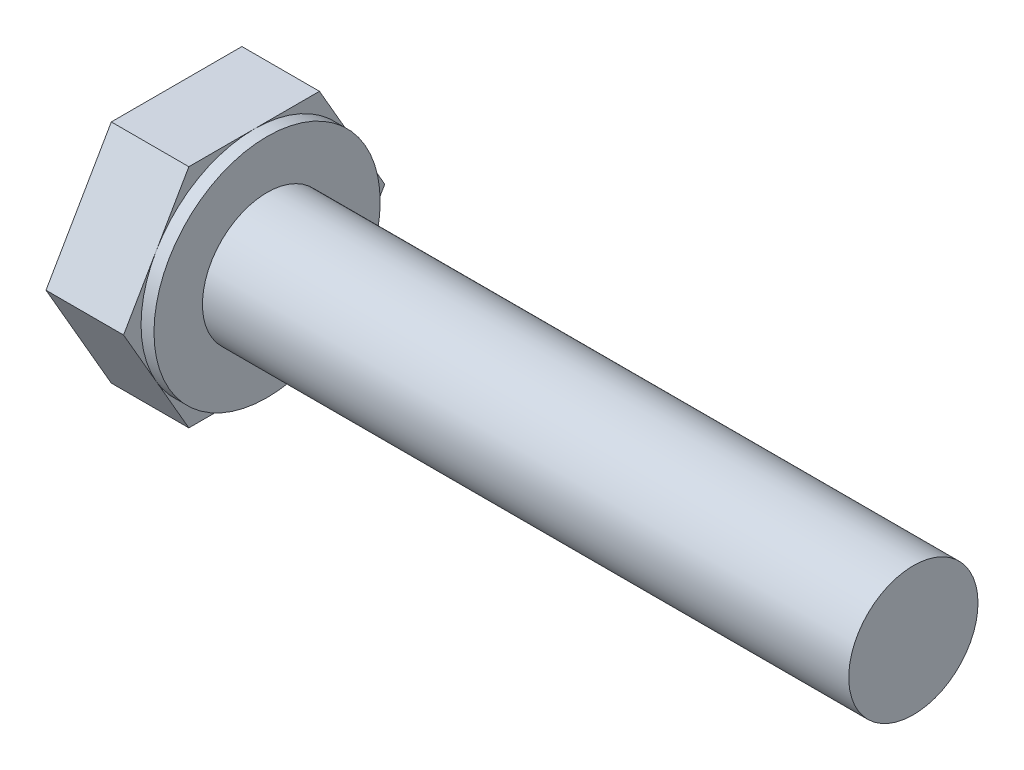
ISO-10303-21;
HEADER;
FILE_DESCRIPTION(('STEP AP214'),'2;1');
FILE_NAME('part.step','',(''),(''),'','','');
FILE_SCHEMA(('AUTOMOTIVE_DESIGN { 1 0 10303 214 1 1 1 1 }'));
ENDSEC;
DATA;
#1=APPLICATION_CONTEXT('core data for automotive mechanical design processes');
#2=APPLICATION_PROTOCOL_DEFINITION('international standard','automotive_design',2000,#1);
#3=PRODUCT_CONTEXT('',#1,'mechanical');
#4=PRODUCT('Part','Part','',(#3));
#5=PRODUCT_RELATED_PRODUCT_CATEGORY('part','',(#4));
#6=PRODUCT_DEFINITION_FORMATION('','',#4);
#7=PRODUCT_DEFINITION_CONTEXT('part definition',#1,'design');
#8=PRODUCT_DEFINITION('design','',#6,#7);
#9=PRODUCT_DEFINITION_SHAPE('','',#8);
#10=(LENGTH_UNIT() NAMED_UNIT(*) SI_UNIT(.MILLI.,.METRE.));
#11=(NAMED_UNIT(*) PLANE_ANGLE_UNIT() SI_UNIT($,.RADIAN.));
#12=(NAMED_UNIT(*) SI_UNIT($,.STERADIAN.) SOLID_ANGLE_UNIT());
#13=UNCERTAINTY_MEASURE_WITH_UNIT(LENGTH_MEASURE(1.E-05),#10,'distance_accuracy_value','');
#14=(GEOMETRIC_REPRESENTATION_CONTEXT(3) GLOBAL_UNCERTAINTY_ASSIGNED_CONTEXT((#13)) GLOBAL_UNIT_ASSIGNED_CONTEXT((#10,
#11,#12)) REPRESENTATION_CONTEXT('',''));
#15=CARTESIAN_POINT('',(0.,0.,0.));
#16=DIRECTION('',(0.,0.,1.));
#17=DIRECTION('',(1.,0.,0.));
#18=AXIS2_PLACEMENT_3D('',#15,#16,#17);
#19=CARTESIAN_POINT('',(0.4,0.,0.));
#20=DIRECTION('',(1.,0.,0.));
#21=DIRECTION('',(0.,0.,-1.));
#22=AXIS2_PLACEMENT_3D('',#19,#20,#21);
#23=PLANE('',#22);
#24=CARTESIAN_POINT('',(0.4,0.,0.));
#25=DIRECTION('',(1.,0.,0.));
#26=DIRECTION('',(0.,0.,-1.));
#27=AXIS2_PLACEMENT_3D('',#24,#25,#26);
#28=CIRCLE('',#27,3.5);
#29=CARTESIAN_POINT('',(0.4,0.,-3.5));
#30=VERTEX_POINT('',#29);
#31=EDGE_CURVE('E126',#30,#30,#28,.T.);
#32=ORIENTED_EDGE('',*,*,#31,.T.);
#33=EDGE_LOOP('',(#32));
#34=FACE_BOUND('',#33,.T.);
#35=CARTESIAN_POINT('',(0.4,0.,0.));
#36=DIRECTION('',(1.,0.,0.));
#37=DIRECTION('',(0.,0.,-1.));
#38=AXIS2_PLACEMENT_3D('',#35,#36,#37);
#39=CIRCLE('',#38,2.);
#40=CARTESIAN_POINT('',(0.4,0.,-2.));
#41=VERTEX_POINT('',#40);
#42=EDGE_CURVE('E349',#41,#41,#39,.T.);
#43=ORIENTED_EDGE('',*,*,#42,.F.);
#44=EDGE_LOOP('',(#43));
#45=FACE_BOUND('',#44,.T.);
#46=ADVANCED_FACE('F33',(#34,#45),#23,.T.);
#47=CARTESIAN_POINT('',(0.,0.,0.));
#48=DIRECTION('',(1.,0.,0.));
#49=DIRECTION('',(0.,0.,-1.));
#50=AXIS2_PLACEMENT_3D('',#47,#48,#49);
#51=PLANE('',#50);
#52=CARTESIAN_POINT('',(0.,0.,0.));
#53=DIRECTION('',(1.,0.,0.));
#54=DIRECTION('',(0.,0.,-1.));
#55=AXIS2_PLACEMENT_3D('',#52,#53,#54);
#56=CIRCLE('',#55,3.5);
#57=CARTESIAN_POINT('',(0.,1.75,-3.03108891324554));
#58=VERTEX_POINT('',#57);
#59=CARTESIAN_POINT('',(0.,3.5,0.));
#60=VERTEX_POINT('',#59);
#61=EDGE_CURVE('E44',#58,#60,#56,.T.);
#62=ORIENTED_EDGE('',*,*,#61,.F.);
#63=DIRECTION('',(0.,0.866025403784439,0.5));
#64=VECTOR('',#63,1.);
#65=CARTESIAN_POINT('',(0.,0.,-4.04145188432738));
#66=LINE('',#65,#64);
#67=CARTESIAN_POINT('',(0.,3.5,-2.02072594216369));
#68=VERTEX_POINT('',#67);
#69=EDGE_CURVE('E111',#58,#68,#66,.T.);
#70=ORIENTED_EDGE('',*,*,#69,.T.);
#71=DIRECTION('',(0.,0.,1.));
#72=VECTOR('',#71,1.);
#73=CARTESIAN_POINT('',(0.,3.5,-2.02072594216369));
#74=LINE('',#73,#72);
#75=EDGE_CURVE('E124',#68,#60,#74,.T.);
#76=ORIENTED_EDGE('',*,*,#75,.T.);
#77=EDGE_LOOP('',(#62,#70,#76));
#78=FACE_BOUND('',#77,.T.);
#79=ADVANCED_FACE('F123',(#78),#51,.T.);
#80=CARTESIAN_POINT('',(0.,1.75,3.03108891324554));
#81=VERTEX_POINT('',#80);
#82=EDGE_CURVE('E11',#60,#81,#56,.T.);
#83=ORIENTED_EDGE('',*,*,#82,.F.);
#84=CARTESIAN_POINT('',(0.,3.5,2.02072594216369));
#85=VERTEX_POINT('',#84);
#86=EDGE_CURVE('E110',#60,#85,#74,.T.);
#87=ORIENTED_EDGE('',*,*,#86,.T.);
#88=DIRECTION('',(0.,-0.866025403784439,0.5));
#89=VECTOR('',#88,1.);
#90=CARTESIAN_POINT('',(0.,3.5,2.02072594216369));
#91=LINE('',#90,#89);
#92=EDGE_CURVE('E156',#85,#81,#91,.T.);
#93=ORIENTED_EDGE('',*,*,#92,.T.);
#94=EDGE_LOOP('',(#83,#87,#93));
#95=FACE_BOUND('',#94,.T.);
#96=ADVANCED_FACE('F209',(#95),#51,.T.);
#97=CARTESIAN_POINT('',(0.,-1.75,3.03108891324554));
#98=VERTEX_POINT('',#97);
#99=EDGE_CURVE('E42',#81,#98,#56,.T.);
#100=ORIENTED_EDGE('',*,*,#99,.F.);
#101=CARTESIAN_POINT('',(0.,0.,4.04145188432738));
#102=VERTEX_POINT('',#101);
#103=EDGE_CURVE('E159',#81,#102,#91,.T.);
#104=ORIENTED_EDGE('',*,*,#103,.T.);
#105=DIRECTION('',(0.,-0.866025403784439,-0.5));
#106=VECTOR('',#105,1.);
#107=CARTESIAN_POINT('',(0.,0.,4.04145188432738));
#108=LINE('',#107,#106);
#109=EDGE_CURVE('E160',#102,#98,#108,.T.);
#110=ORIENTED_EDGE('',*,*,#109,.T.);
#111=EDGE_LOOP('',(#100,#104,#110));
#112=FACE_BOUND('',#111,.T.);
#113=ADVANCED_FACE('F190',(#112),#51,.T.);
#114=CARTESIAN_POINT('',(0.,-3.5,0.));
#115=VERTEX_POINT('',#114);
#116=EDGE_CURVE('E133',#98,#115,#56,.T.);
#117=ORIENTED_EDGE('',*,*,#116,.F.);
#118=CARTESIAN_POINT('',(0.,-3.5,2.02072594216369));
#119=VERTEX_POINT('',#118);
#120=EDGE_CURVE('E158',#98,#119,#108,.T.);
#121=ORIENTED_EDGE('',*,*,#120,.T.);
#122=DIRECTION('',(0.,0.,-1.));
#123=VECTOR('',#122,1.);
#124=CARTESIAN_POINT('',(0.,-3.5,2.02072594216369));
#125=LINE('',#124,#123);
#126=EDGE_CURVE('E164',#119,#115,#125,.T.);
#127=ORIENTED_EDGE('',*,*,#126,.T.);
#128=EDGE_LOOP('',(#117,#121,#127));
#129=FACE_BOUND('',#128,.T.);
#130=ADVANCED_FACE('F192',(#129),#51,.T.);
#131=CARTESIAN_POINT('',(0.,-1.75,-3.03108891324553));
#132=VERTEX_POINT('',#131);
#133=EDGE_CURVE('E131',#115,#132,#56,.T.);
#134=ORIENTED_EDGE('',*,*,#133,.F.);
#135=CARTESIAN_POINT('',(0.,-3.5,-2.02072594216369));
#136=VERTEX_POINT('',#135);
#137=EDGE_CURVE('E163',#115,#136,#125,.T.);
#138=ORIENTED_EDGE('',*,*,#137,.T.);
#139=DIRECTION('',(0.,0.866025403784439,-0.5));
#140=VECTOR('',#139,1.);
#141=CARTESIAN_POINT('',(0.,-3.5,-2.02072594216369));
#142=LINE('',#141,#140);
#143=EDGE_CURVE('E121',#136,#132,#142,.T.);
#144=ORIENTED_EDGE('',*,*,#143,.T.);
#145=EDGE_LOOP('',(#134,#138,#144));
#146=FACE_BOUND('',#145,.T.);
#147=ADVANCED_FACE('F199',(#146),#51,.T.);
#148=CARTESIAN_POINT('',(-2.4,3.5,2.02072594216369));
#149=DIRECTION('',(0.,0.5,0.866025403784439));
#150=DIRECTION('',(0.,-0.866025403784439,0.5));
#151=AXIS2_PLACEMENT_3D('',#148,#149,#150);
#152=PLANE('',#151);
#153=ORIENTED_EDGE('',*,*,#92,.F.);
#154=DIRECTION('',(1.,0.,0.));
#155=VECTOR('',#154,1.);
#156=CARTESIAN_POINT('',(-2.4,3.5,2.02072594216369));
#157=LINE('',#156,#155);
#158=CARTESIAN_POINT('',(-2.4,3.5,2.02072594216369));
#159=VERTEX_POINT('',#158);
#160=EDGE_CURVE('E132',#159,#85,#157,.T.);
#161=ORIENTED_EDGE('',*,*,#160,.F.);
#162=DIRECTION('',(0.,-0.866025403784439,0.5));
#163=VECTOR('',#162,1.);
#164=CARTESIAN_POINT('',(-2.4,3.5,2.02072594216369));
#165=LINE('',#164,#163);
#166=CARTESIAN_POINT('',(-2.4,0.,4.04145188432738));
#167=VERTEX_POINT('',#166);
#168=EDGE_CURVE('E139',#159,#167,#165,.T.);
#169=ORIENTED_EDGE('',*,*,#168,.T.);
#170=DIRECTION('',(1.,0.,0.));
#171=VECTOR('',#170,1.);
#172=CARTESIAN_POINT('',(-2.4,0.,4.04145188432738));
#173=LINE('',#172,#171);
#174=EDGE_CURVE('E37',#167,#102,#173,.T.);
#175=ORIENTED_EDGE('',*,*,#174,.T.);
#176=ORIENTED_EDGE('',*,*,#103,.F.);
#177=EDGE_LOOP('',(#153,#161,#169,#175,#176));
#178=FACE_BOUND('',#177,.T.);
#179=ADVANCED_FACE('F35',(#178),#152,.T.);
#180=CARTESIAN_POINT('',(-2.4,3.5,-2.02072594216369));
#181=DIRECTION('',(0.,1.,0.));
#182=DIRECTION('',(0.,0.,1.));
#183=AXIS2_PLACEMENT_3D('',#180,#181,#182);
#184=PLANE('',#183);
#185=ORIENTED_EDGE('',*,*,#75,.F.);
#186=DIRECTION('',(1.,0.,0.));
#187=VECTOR('',#186,1.);
#188=CARTESIAN_POINT('',(-2.4,3.5,-2.02072594216369));
#189=LINE('',#188,#187);
#190=CARTESIAN_POINT('',(-2.4,3.5,-2.02072594216369));
#191=VERTEX_POINT('',#190);
#192=EDGE_CURVE('E117',#191,#68,#189,.T.);
#193=ORIENTED_EDGE('',*,*,#192,.F.);
#194=DIRECTION('',(0.,0.,1.));
#195=VECTOR('',#194,1.);
#196=CARTESIAN_POINT('',(-2.4,3.5,-2.02072594216369));
#197=LINE('',#196,#195);
#198=EDGE_CURVE('E153',#191,#159,#197,.T.);
#199=ORIENTED_EDGE('',*,*,#198,.T.);
#200=ORIENTED_EDGE('',*,*,#160,.T.);
#201=ORIENTED_EDGE('',*,*,#86,.F.);
#202=EDGE_LOOP('',(#185,#193,#199,#200,#201));
#203=FACE_BOUND('',#202,.T.);
#204=ADVANCED_FACE('F208',(#203),#184,.T.);
#205=CARTESIAN_POINT('',(-2.4,0.,-4.04145188432738));
#206=DIRECTION('',(0.,0.5,-0.866025403784439));
#207=DIRECTION('',(0.,0.866025403784439,0.5));
#208=AXIS2_PLACEMENT_3D('',#205,#206,#207);
#209=PLANE('',#208);
#210=CARTESIAN_POINT('',(0.,0.,-4.04145188432738));
#211=VERTEX_POINT('',#210);
#212=EDGE_CURVE('E104',#211,#58,#66,.T.);
#213=ORIENTED_EDGE('',*,*,#212,.F.);
#214=DIRECTION('',(1.,0.,0.));
#215=VECTOR('',#214,1.);
#216=CARTESIAN_POINT('',(-2.4,0.,-4.04145188432738));
#217=LINE('',#216,#215);
#218=CARTESIAN_POINT('',(-2.4,0.,-4.04145188432738));
#219=VERTEX_POINT('',#218);
#220=EDGE_CURVE('E171',#219,#211,#217,.T.);
#221=ORIENTED_EDGE('',*,*,#220,.F.);
#222=DIRECTION('',(0.,0.866025403784439,0.5));
#223=VECTOR('',#222,1.);
#224=CARTESIAN_POINT('',(-2.4,0.,-4.04145188432738));
#225=LINE('',#224,#223);
#226=EDGE_CURVE('E151',#219,#191,#225,.T.);
#227=ORIENTED_EDGE('',*,*,#226,.T.);
#228=ORIENTED_EDGE('',*,*,#192,.T.);
#229=ORIENTED_EDGE('',*,*,#69,.F.);
#230=EDGE_LOOP('',(#213,#221,#227,#228,#229));
#231=FACE_BOUND('',#230,.T.);
#232=ADVANCED_FACE('F115',(#231),#209,.T.);
#233=CARTESIAN_POINT('',(-2.4,-3.5,-2.02072594216369));
#234=DIRECTION('',(0.,-0.5,-0.866025403784439));
#235=DIRECTION('',(0.,0.866025403784439,-0.5));
#236=AXIS2_PLACEMENT_3D('',#233,#234,#235);
#237=PLANE('',#236);
#238=ORIENTED_EDGE('',*,*,#143,.F.);
#239=DIRECTION('',(1.,0.,0.));
#240=VECTOR('',#239,1.);
#241=CARTESIAN_POINT('',(-2.4,-3.5,-2.02072594216369));
#242=LINE('',#241,#240);
#243=CARTESIAN_POINT('',(-2.4,-3.5,-2.02072594216369));
#244=VERTEX_POINT('',#243);
#245=EDGE_CURVE('E173',#244,#136,#242,.T.);
#246=ORIENTED_EDGE('',*,*,#245,.F.);
#247=DIRECTION('',(0.,0.866025403784439,-0.5));
#248=VECTOR('',#247,1.);
#249=CARTESIAN_POINT('',(-2.4,-3.5,-2.02072594216369));
#250=LINE('',#249,#248);
#251=EDGE_CURVE('E148',#244,#219,#250,.T.);
#252=ORIENTED_EDGE('',*,*,#251,.T.);
#253=ORIENTED_EDGE('',*,*,#220,.T.);
#254=EDGE_CURVE('E107',#132,#211,#142,.T.);
#255=ORIENTED_EDGE('',*,*,#254,.F.);
#256=EDGE_LOOP('',(#238,#246,#252,#253,#255));
#257=FACE_BOUND('',#256,.T.);
#258=ADVANCED_FACE('F201',(#257),#237,.T.);
#259=CARTESIAN_POINT('',(-2.4,-3.5,2.02072594216369));
#260=DIRECTION('',(0.,-1.,0.));
#261=DIRECTION('',(0.,0.,-1.));
#262=AXIS2_PLACEMENT_3D('',#259,#260,#261);
#263=PLANE('',#262);
#264=ORIENTED_EDGE('',*,*,#126,.F.);
#265=DIRECTION('',(1.,0.,0.));
#266=VECTOR('',#265,1.);
#267=CARTESIAN_POINT('',(-2.4,-3.5,2.02072594216369));
#268=LINE('',#267,#266);
#269=CARTESIAN_POINT('',(-2.4,-3.5,2.02072594216369));
#270=VERTEX_POINT('',#269);
#271=EDGE_CURVE('E175',#270,#119,#268,.T.);
#272=ORIENTED_EDGE('',*,*,#271,.F.);
#273=DIRECTION('',(0.,0.,-1.));
#274=VECTOR('',#273,1.);
#275=CARTESIAN_POINT('',(-2.4,-3.5,2.02072594216369));
#276=LINE('',#275,#274);
#277=EDGE_CURVE('E145',#270,#244,#276,.T.);
#278=ORIENTED_EDGE('',*,*,#277,.T.);
#279=ORIENTED_EDGE('',*,*,#245,.T.);
#280=ORIENTED_EDGE('',*,*,#137,.F.);
#281=EDGE_LOOP('',(#264,#272,#278,#279,#280));
#282=FACE_BOUND('',#281,.T.);
#283=ADVANCED_FACE('F195',(#282),#263,.T.);
#284=CARTESIAN_POINT('',(-2.4,0.,4.04145188432738));
#285=DIRECTION('',(0.,-0.5,0.866025403784439));
#286=DIRECTION('',(0.,-0.866025403784439,-0.5));
#287=AXIS2_PLACEMENT_3D('',#284,#285,#286);
#288=PLANE('',#287);
#289=ORIENTED_EDGE('',*,*,#109,.F.);
#290=ORIENTED_EDGE('',*,*,#174,.F.);
#291=DIRECTION('',(0.,-0.866025403784439,-0.5));
#292=VECTOR('',#291,1.);
#293=CARTESIAN_POINT('',(-2.4,0.,4.04145188432738));
#294=LINE('',#293,#292);
#295=EDGE_CURVE('E142',#167,#270,#294,.T.);
#296=ORIENTED_EDGE('',*,*,#295,.T.);
#297=ORIENTED_EDGE('',*,*,#271,.T.);
#298=ORIENTED_EDGE('',*,*,#120,.F.);
#299=EDGE_LOOP('',(#289,#290,#296,#297,#298));
#300=FACE_BOUND('',#299,.T.);
#301=ADVANCED_FACE('F187',(#300),#288,.T.);
#302=CARTESIAN_POINT('',(-2.4,0.,0.));
#303=DIRECTION('',(1.,0.,0.));
#304=DIRECTION('',(0.,0.,-1.));
#305=AXIS2_PLACEMENT_3D('',#302,#303,#304);
#306=PLANE('',#305);
#307=ORIENTED_EDGE('',*,*,#168,.F.);
#308=ORIENTED_EDGE('',*,*,#198,.F.);
#309=ORIENTED_EDGE('',*,*,#226,.F.);
#310=ORIENTED_EDGE('',*,*,#251,.F.);
#311=ORIENTED_EDGE('',*,*,#277,.F.);
#312=ORIENTED_EDGE('',*,*,#295,.F.);
#313=EDGE_LOOP('',(#307,#308,#309,#310,#311,#312));
#314=FACE_BOUND('',#313,.T.);
#315=ADVANCED_FACE('F206',(#314),#306,.F.);
#316=EDGE_CURVE('E57',#132,#58,#56,.T.);
#317=ORIENTED_EDGE('',*,*,#316,.F.);
#318=ORIENTED_EDGE('',*,*,#254,.T.);
#319=ORIENTED_EDGE('',*,*,#212,.T.);
#320=EDGE_LOOP('',(#317,#318,#319));
#321=FACE_BOUND('',#320,.T.);
#322=ADVANCED_FACE('F106',(#321),#51,.T.);
#323=CARTESIAN_POINT('',(0.4,0.,0.));
#324=DIRECTION('',(-1.,0.,0.));
#325=DIRECTION('',(0.,0.,1.));
#326=AXIS2_PLACEMENT_3D('',#323,#324,#325);
#327=CYLINDRICAL_SURFACE('',#326,3.5);
#328=ORIENTED_EDGE('',*,*,#31,.F.);
#329=EDGE_LOOP('',(#328));
#330=FACE_BOUND('',#329,.T.);
#331=ORIENTED_EDGE('',*,*,#61,.T.);
#332=ORIENTED_EDGE('',*,*,#82,.T.);
#333=ORIENTED_EDGE('',*,*,#99,.T.);
#334=ORIENTED_EDGE('',*,*,#116,.T.);
#335=ORIENTED_EDGE('',*,*,#133,.T.);
#336=ORIENTED_EDGE('',*,*,#316,.T.);
#337=EDGE_LOOP('',(#331,#332,#333,#334,#335,#336));
#338=FACE_BOUND('',#337,.T.);
#339=ADVANCED_FACE('F129',(#330,#338),#327,.T.);
#340=CARTESIAN_POINT('',(20.4,0.,0.));
#341=DIRECTION('',(-1.,0.,0.));
#342=DIRECTION('',(0.,0.,1.));
#343=AXIS2_PLACEMENT_3D('',#340,#341,#342);
#344=CYLINDRICAL_SURFACE('',#343,2.);
#345=CARTESIAN_POINT('',(20.4,0.,0.));
#346=DIRECTION('',(1.,0.,0.));
#347=DIRECTION('',(0.,0.,-1.));
#348=AXIS2_PLACEMENT_3D('',#345,#346,#347);
#349=CIRCLE('',#348,2.);
#350=CARTESIAN_POINT('',(20.4,0.,-2.));
#351=VERTEX_POINT('',#350);
#352=EDGE_CURVE('E127',#351,#351,#349,.T.);
#353=ORIENTED_EDGE('',*,*,#352,.F.);
#354=EDGE_LOOP('',(#353));
#355=FACE_BOUND('',#354,.T.);
#356=ORIENTED_EDGE('',*,*,#42,.T.);
#357=EDGE_LOOP('',(#356));
#358=FACE_BOUND('',#357,.T.);
#359=ADVANCED_FACE('F227',(#355,#358),#344,.T.);
#360=CARTESIAN_POINT('',(20.4,0.,0.));
#361=DIRECTION('',(1.,0.,0.));
#362=DIRECTION('',(0.,0.,-1.));
#363=AXIS2_PLACEMENT_3D('',#360,#361,#362);
#364=PLANE('',#363);
#365=ORIENTED_EDGE('',*,*,#352,.T.);
#366=EDGE_LOOP('',(#365));
#367=FACE_BOUND('',#366,.T.);
#368=ADVANCED_FACE('F335',(#367),#364,.T.);
#369=CLOSED_SHELL('',(#46,#79,#96,#113,#130,#147,#179,#204,#232,#258,#283,#301,#315,#322,#339,
#359,#368));
#370=MANIFOLD_SOLID_BREP('B2',#369);
#371=ADVANCED_BREP_SHAPE_REPRESENTATION('',(#18,#370),#14);
#372=SHAPE_DEFINITION_REPRESENTATION(#9,#371);
ENDSEC;
END-ISO-10303-21;
